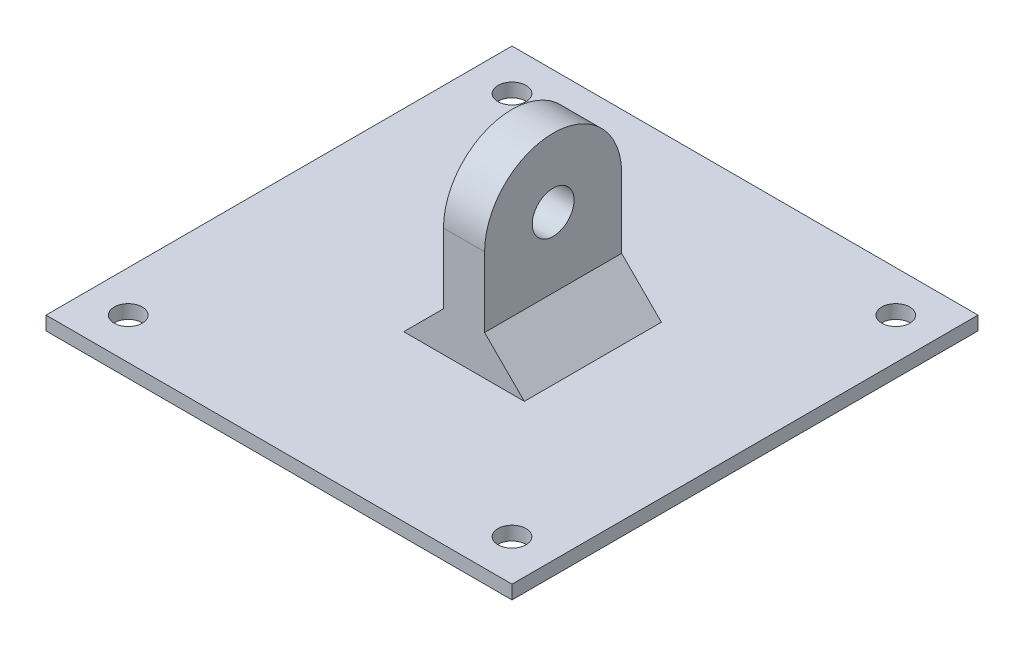
ISO-10303-21;
HEADER;
FILE_DESCRIPTION(('STEP AP214'),'2;1');
FILE_NAME('part.step','',(''),(''),'','','');
FILE_SCHEMA(('AUTOMOTIVE_DESIGN { 1 0 10303 214 1 1 1 1 }'));
ENDSEC;
DATA;
#1=APPLICATION_CONTEXT('core data for automotive mechanical design processes');
#2=APPLICATION_PROTOCOL_DEFINITION('international standard','automotive_design',2000,#1);
#3=PRODUCT_CONTEXT('',#1,'mechanical');
#4=PRODUCT('Part','Part','',(#3));
#5=PRODUCT_RELATED_PRODUCT_CATEGORY('part','',(#4));
#6=PRODUCT_DEFINITION_FORMATION('','',#4);
#7=PRODUCT_DEFINITION_CONTEXT('part definition',#1,'design');
#8=PRODUCT_DEFINITION('design','',#6,#7);
#9=PRODUCT_DEFINITION_SHAPE('','',#8);
#10=(LENGTH_UNIT() NAMED_UNIT(*) SI_UNIT(.MILLI.,.METRE.));
#11=(NAMED_UNIT(*) PLANE_ANGLE_UNIT() SI_UNIT($,.RADIAN.));
#12=(NAMED_UNIT(*) SI_UNIT($,.STERADIAN.) SOLID_ANGLE_UNIT());
#13=UNCERTAINTY_MEASURE_WITH_UNIT(LENGTH_MEASURE(1.E-05),#10,'distance_accuracy_value','');
#14=(GEOMETRIC_REPRESENTATION_CONTEXT(3) GLOBAL_UNCERTAINTY_ASSIGNED_CONTEXT((#13)) GLOBAL_UNIT_ASSIGNED_CONTEXT((#10,
#11,#12)) REPRESENTATION_CONTEXT('',''));
#15=CARTESIAN_POINT('',(0.,0.,0.));
#16=DIRECTION('',(0.,0.,1.));
#17=DIRECTION('',(1.,0.,0.));
#18=AXIS2_PLACEMENT_3D('',#15,#16,#17);
#19=CARTESIAN_POINT('',(0.,1.,0.));
#20=DIRECTION('',(0.,-1.,0.));
#21=DIRECTION('',(0.,0.,-1.));
#22=AXIS2_PLACEMENT_3D('',#19,#20,#21);
#23=PLANE('',#22);
#24=CARTESIAN_POINT('',(-13.9999999999997,1.,14.));
#25=DIRECTION('',(0.,1.,0.));
#26=DIRECTION('',(0.,0.,1.));
#27=AXIS2_PLACEMENT_3D('',#24,#25,#26);
#28=CIRCLE('',#27,1.025);
#29=CARTESIAN_POINT('',(-13.9999999999997,1.,15.025));
#30=VERTEX_POINT('',#29);
#31=EDGE_CURVE('E155',#30,#30,#28,.T.);
#32=ORIENTED_EDGE('',*,*,#31,.F.);
#33=EDGE_LOOP('',(#32));
#34=FACE_BOUND('',#33,.T.);
#35=CARTESIAN_POINT('',(14.0000000000003,1.,14.));
#36=DIRECTION('',(0.,1.,0.));
#37=DIRECTION('',(0.,0.,1.));
#38=AXIS2_PLACEMENT_3D('',#35,#36,#37);
#39=CIRCLE('',#38,1.025);
#40=CARTESIAN_POINT('',(14.0000000000003,1.,15.025));
#41=VERTEX_POINT('',#40);
#42=EDGE_CURVE('E161',#41,#41,#39,.T.);
#43=ORIENTED_EDGE('',*,*,#42,.F.);
#44=EDGE_LOOP('',(#43));
#45=FACE_BOUND('',#44,.T.);
#46=CARTESIAN_POINT('',(14.,1.,-14.));
#47=DIRECTION('',(0.,1.,0.));
#48=DIRECTION('',(0.,0.,1.));
#49=AXIS2_PLACEMENT_3D('',#46,#47,#48);
#50=CIRCLE('',#49,1.025);
#51=CARTESIAN_POINT('',(14.,1.,-12.975));
#52=VERTEX_POINT('',#51);
#53=EDGE_CURVE('E167',#52,#52,#50,.T.);
#54=ORIENTED_EDGE('',*,*,#53,.F.);
#55=EDGE_LOOP('',(#54));
#56=FACE_BOUND('',#55,.T.);
#57=CARTESIAN_POINT('',(-14.,1.,-14.));
#58=DIRECTION('',(0.,1.,0.));
#59=DIRECTION('',(0.,0.,1.));
#60=AXIS2_PLACEMENT_3D('',#57,#58,#59);
#61=CIRCLE('',#60,1.025);
#62=CARTESIAN_POINT('',(-14.,1.,-12.975));
#63=VERTEX_POINT('',#62);
#64=EDGE_CURVE('E173',#63,#63,#61,.T.);
#65=ORIENTED_EDGE('',*,*,#64,.F.);
#66=EDGE_LOOP('',(#65));
#67=FACE_BOUND('',#66,.T.);
#68=DIRECTION('',(0.,0.,-1.));
#69=VECTOR('',#68,1.);
#70=CARTESIAN_POINT('',(17.,1.,17.));
#71=LINE('',#70,#69);
#72=CARTESIAN_POINT('',(17.,1.,17.));
#73=VERTEX_POINT('',#72);
#74=CARTESIAN_POINT('',(17.,1.,-17.));
#75=VERTEX_POINT('',#74);
#76=EDGE_CURVE('E179',#73,#75,#71,.T.);
#77=ORIENTED_EDGE('',*,*,#76,.T.);
#78=DIRECTION('',(-1.,0.,0.));
#79=VECTOR('',#78,1.);
#80=CARTESIAN_POINT('',(-17.,1.,-17.));
#81=LINE('',#80,#79);
#82=CARTESIAN_POINT('',(-17.,1.,-17.));
#83=VERTEX_POINT('',#82);
#84=EDGE_CURVE('E182',#75,#83,#81,.T.);
#85=ORIENTED_EDGE('',*,*,#84,.T.);
#86=DIRECTION('',(0.,0.,1.));
#87=VECTOR('',#86,1.);
#88=CARTESIAN_POINT('',(-17.,1.,17.));
#89=LINE('',#88,#87);
#90=CARTESIAN_POINT('',(-17.,1.,17.));
#91=VERTEX_POINT('',#90);
#92=EDGE_CURVE('E185',#83,#91,#89,.T.);
#93=ORIENTED_EDGE('',*,*,#92,.T.);
#94=DIRECTION('',(1.,0.,0.));
#95=VECTOR('',#94,1.);
#96=CARTESIAN_POINT('',(-17.,1.,17.));
#97=LINE('',#96,#95);
#98=EDGE_CURVE('E187',#91,#73,#97,.T.);
#99=ORIENTED_EDGE('',*,*,#98,.T.);
#100=EDGE_LOOP('',(#77,#85,#93,#99));
#101=FACE_BOUND('',#100,.T.);
#102=DIRECTION('',(0.,0.,-1.));
#103=VECTOR('',#102,1.);
#104=CARTESIAN_POINT('',(-2.90000000000002,1.,0.));
#105=LINE('',#104,#103);
#106=CARTESIAN_POINT('',(-2.90000000000002,1.,5.));
#107=VERTEX_POINT('',#106);
#108=CARTESIAN_POINT('',(-2.90000000000002,1.,-5.));
#109=VERTEX_POINT('',#108);
#110=EDGE_CURVE('E211',#107,#109,#105,.T.);
#111=ORIENTED_EDGE('',*,*,#110,.T.);
#112=DIRECTION('',(-1.,0.,0.));
#113=VECTOR('',#112,1.);
#114=CARTESIAN_POINT('',(3.,1.,-5.));
#115=LINE('',#114,#113);
#116=CARTESIAN_POINT('',(5.89999999999999,1.,-5.));
#117=VERTEX_POINT('',#116);
#118=EDGE_CURVE('E135',#117,#109,#115,.T.);
#119=ORIENTED_EDGE('',*,*,#118,.F.);
#120=DIRECTION('',(0.,0.,1.));
#121=VECTOR('',#120,1.);
#122=CARTESIAN_POINT('',(5.89999999999999,1.,5.));
#123=LINE('',#122,#121);
#124=CARTESIAN_POINT('',(5.89999999999999,1.,5.));
#125=VERTEX_POINT('',#124);
#126=EDGE_CURVE('E208',#117,#125,#123,.T.);
#127=ORIENTED_EDGE('',*,*,#126,.T.);
#128=DIRECTION('',(-1.,0.,0.));
#129=VECTOR('',#128,1.);
#130=CARTESIAN_POINT('',(3.,1.,5.));
#131=LINE('',#130,#129);
#132=EDGE_CURVE('E152',#125,#107,#131,.T.);
#133=ORIENTED_EDGE('',*,*,#132,.T.);
#134=EDGE_LOOP('',(#111,#119,#127,#133));
#135=FACE_BOUND('',#134,.T.);
#136=ADVANCED_FACE('F40',(#34,#45,#56,#67,#101,#135),#23,.F.);
#137=CARTESIAN_POINT('',(0.,0.,0.));
#138=DIRECTION('',(0.,-1.,0.));
#139=DIRECTION('',(0.,0.,-1.));
#140=AXIS2_PLACEMENT_3D('',#137,#138,#139);
#141=PLANE('',#140);
#142=CARTESIAN_POINT('',(14.0000000000003,0.,14.));
#143=DIRECTION('',(0.,1.,0.));
#144=DIRECTION('',(0.,0.,1.));
#145=AXIS2_PLACEMENT_3D('',#142,#143,#144);
#146=CIRCLE('',#145,1.025);
#147=CARTESIAN_POINT('',(14.0000000000003,0.,15.025));
#148=VERTEX_POINT('',#147);
#149=EDGE_CURVE('E158',#148,#148,#146,.T.);
#150=ORIENTED_EDGE('',*,*,#149,.T.);
#151=EDGE_LOOP('',(#150));
#152=FACE_BOUND('',#151,.T.);
#153=CARTESIAN_POINT('',(-14.,0.,-14.));
#154=DIRECTION('',(0.,1.,0.));
#155=DIRECTION('',(0.,0.,1.));
#156=AXIS2_PLACEMENT_3D('',#153,#154,#155);
#157=CIRCLE('',#156,1.025);
#158=CARTESIAN_POINT('',(-14.,0.,-12.975));
#159=VERTEX_POINT('',#158);
#160=EDGE_CURVE('E170',#159,#159,#157,.T.);
#161=ORIENTED_EDGE('',*,*,#160,.T.);
#162=EDGE_LOOP('',(#161));
#163=FACE_BOUND('',#162,.T.);
#164=DIRECTION('',(0.,0.,-1.));
#165=VECTOR('',#164,1.);
#166=CARTESIAN_POINT('',(17.,0.,17.));
#167=LINE('',#166,#165);
#168=CARTESIAN_POINT('',(17.,0.,17.));
#169=VERTEX_POINT('',#168);
#170=CARTESIAN_POINT('',(17.,0.,-17.));
#171=VERTEX_POINT('',#170);
#172=EDGE_CURVE('E176',#169,#171,#167,.T.);
#173=ORIENTED_EDGE('',*,*,#172,.F.);
#174=DIRECTION('',(1.,0.,0.));
#175=VECTOR('',#174,1.);
#176=CARTESIAN_POINT('',(-17.,0.,17.));
#177=LINE('',#176,#175);
#178=CARTESIAN_POINT('',(-17.,0.,17.));
#179=VERTEX_POINT('',#178);
#180=EDGE_CURVE('E183',#179,#169,#177,.T.);
#181=ORIENTED_EDGE('',*,*,#180,.F.);
#182=DIRECTION('',(0.,0.,1.));
#183=VECTOR('',#182,1.);
#184=CARTESIAN_POINT('',(-17.,0.,17.));
#185=LINE('',#184,#183);
#186=CARTESIAN_POINT('',(-17.,0.,-17.));
#187=VERTEX_POINT('',#186);
#188=EDGE_CURVE('E194',#187,#179,#185,.T.);
#189=ORIENTED_EDGE('',*,*,#188,.F.);
#190=DIRECTION('',(-1.,0.,0.));
#191=VECTOR('',#190,1.);
#192=CARTESIAN_POINT('',(-17.,0.,-17.));
#193=LINE('',#192,#191);
#194=EDGE_CURVE('E192',#171,#187,#193,.T.);
#195=ORIENTED_EDGE('',*,*,#194,.F.);
#196=EDGE_LOOP('',(#173,#181,#189,#195));
#197=FACE_BOUND('',#196,.T.);
#198=CARTESIAN_POINT('',(14.,0.,-14.));
#199=DIRECTION('',(0.,1.,0.));
#200=DIRECTION('',(0.,0.,1.));
#201=AXIS2_PLACEMENT_3D('',#198,#199,#200);
#202=CIRCLE('',#201,1.025);
#203=CARTESIAN_POINT('',(14.,0.,-12.975));
#204=VERTEX_POINT('',#203);
#205=EDGE_CURVE('E164',#204,#204,#202,.T.);
#206=ORIENTED_EDGE('',*,*,#205,.T.);
#207=EDGE_LOOP('',(#206));
#208=FACE_BOUND('',#207,.T.);
#209=CARTESIAN_POINT('',(-13.9999999999997,0.,14.));
#210=DIRECTION('',(0.,1.,0.));
#211=DIRECTION('',(0.,0.,1.));
#212=AXIS2_PLACEMENT_3D('',#209,#210,#211);
#213=CIRCLE('',#212,1.025);
#214=CARTESIAN_POINT('',(-13.9999999999997,0.,15.025));
#215=VERTEX_POINT('',#214);
#216=EDGE_CURVE('E154',#215,#215,#213,.T.);
#217=ORIENTED_EDGE('',*,*,#216,.T.);
#218=EDGE_LOOP('',(#217));
#219=FACE_BOUND('',#218,.T.);
#220=ADVANCED_FACE('F255',(#152,#163,#197,#208,#219),#141,.T.);
#221=CARTESIAN_POINT('',(17.,1.,17.));
#222=DIRECTION('',(-1.,0.,0.));
#223=DIRECTION('',(0.,0.,1.));
#224=AXIS2_PLACEMENT_3D('',#221,#222,#223);
#225=PLANE('',#224);
#226=ORIENTED_EDGE('',*,*,#172,.T.);
#227=DIRECTION('',(0.,-1.,0.));
#228=VECTOR('',#227,1.);
#229=CARTESIAN_POINT('',(17.,1.,-17.));
#230=LINE('',#229,#228);
#231=EDGE_CURVE('E205',#75,#171,#230,.T.);
#232=ORIENTED_EDGE('',*,*,#231,.F.);
#233=ORIENTED_EDGE('',*,*,#76,.F.);
#234=DIRECTION('',(0.,-1.,0.));
#235=VECTOR('',#234,1.);
#236=CARTESIAN_POINT('',(17.,1.,17.));
#237=LINE('',#236,#235);
#238=EDGE_CURVE('E189',#73,#169,#237,.T.);
#239=ORIENTED_EDGE('',*,*,#238,.T.);
#240=EDGE_LOOP('',(#226,#232,#233,#239));
#241=FACE_BOUND('',#240,.T.);
#242=ADVANCED_FACE('F261',(#241),#225,.F.);
#243=CARTESIAN_POINT('',(-17.,1.,-17.));
#244=DIRECTION('',(0.,0.,1.));
#245=DIRECTION('',(1.,0.,0.));
#246=AXIS2_PLACEMENT_3D('',#243,#244,#245);
#247=PLANE('',#246);
#248=ORIENTED_EDGE('',*,*,#194,.T.);
#249=DIRECTION('',(0.,-1.,0.));
#250=VECTOR('',#249,1.);
#251=CARTESIAN_POINT('',(-17.,1.,-17.));
#252=LINE('',#251,#250);
#253=EDGE_CURVE('E202',#83,#187,#252,.T.);
#254=ORIENTED_EDGE('',*,*,#253,.F.);
#255=ORIENTED_EDGE('',*,*,#84,.F.);
#256=ORIENTED_EDGE('',*,*,#231,.T.);
#257=EDGE_LOOP('',(#248,#254,#255,#256));
#258=FACE_BOUND('',#257,.T.);
#259=ADVANCED_FACE('F277',(#258),#247,.F.);
#260=CARTESIAN_POINT('',(-17.,1.,17.));
#261=DIRECTION('',(1.,0.,0.));
#262=DIRECTION('',(0.,0.,-1.));
#263=AXIS2_PLACEMENT_3D('',#260,#261,#262);
#264=PLANE('',#263);
#265=ORIENTED_EDGE('',*,*,#188,.T.);
#266=DIRECTION('',(0.,-1.,0.));
#267=VECTOR('',#266,1.);
#268=CARTESIAN_POINT('',(-17.,1.,17.));
#269=LINE('',#268,#267);
#270=EDGE_CURVE('E199',#91,#179,#269,.T.);
#271=ORIENTED_EDGE('',*,*,#270,.F.);
#272=ORIENTED_EDGE('',*,*,#92,.F.);
#273=ORIENTED_EDGE('',*,*,#253,.T.);
#274=EDGE_LOOP('',(#265,#271,#272,#273));
#275=FACE_BOUND('',#274,.T.);
#276=ADVANCED_FACE('F273',(#275),#264,.F.);
#277=CARTESIAN_POINT('',(-17.,1.,17.));
#278=DIRECTION('',(0.,0.,-1.));
#279=DIRECTION('',(-1.,0.,0.));
#280=AXIS2_PLACEMENT_3D('',#277,#278,#279);
#281=PLANE('',#280);
#282=ORIENTED_EDGE('',*,*,#180,.T.);
#283=ORIENTED_EDGE('',*,*,#238,.F.);
#284=ORIENTED_EDGE('',*,*,#98,.F.);
#285=ORIENTED_EDGE('',*,*,#270,.T.);
#286=EDGE_LOOP('',(#282,#283,#284,#285));
#287=FACE_BOUND('',#286,.T.);
#288=ADVANCED_FACE('F270',(#287),#281,.F.);
#289=CARTESIAN_POINT('',(-14.,1.,-14.));
#290=DIRECTION('',(0.,-1.,0.));
#291=DIRECTION('',(0.,0.,-1.));
#292=AXIS2_PLACEMENT_3D('',#289,#290,#291);
#293=CYLINDRICAL_SURFACE('',#292,1.025);
#294=ORIENTED_EDGE('',*,*,#64,.T.);
#295=EDGE_LOOP('',(#294));
#296=FACE_BOUND('',#295,.T.);
#297=ORIENTED_EDGE('',*,*,#160,.F.);
#298=EDGE_LOOP('',(#297));
#299=FACE_BOUND('',#298,.T.);
#300=ADVANCED_FACE('F267',(#296,#299),#293,.F.);
#301=CARTESIAN_POINT('',(14.,1.,-14.));
#302=DIRECTION('',(0.,-1.,0.));
#303=DIRECTION('',(0.,0.,-1.));
#304=AXIS2_PLACEMENT_3D('',#301,#302,#303);
#305=CYLINDRICAL_SURFACE('',#304,1.025);
#306=ORIENTED_EDGE('',*,*,#53,.T.);
#307=EDGE_LOOP('',(#306));
#308=FACE_BOUND('',#307,.T.);
#309=ORIENTED_EDGE('',*,*,#205,.F.);
#310=EDGE_LOOP('',(#309));
#311=FACE_BOUND('',#310,.T.);
#312=ADVANCED_FACE('F304',(#308,#311),#305,.F.);
#313=CARTESIAN_POINT('',(14.0000000000003,1.,14.));
#314=DIRECTION('',(0.,-1.,0.));
#315=DIRECTION('',(0.,0.,-1.));
#316=AXIS2_PLACEMENT_3D('',#313,#314,#315);
#317=CYLINDRICAL_SURFACE('',#316,1.025);
#318=ORIENTED_EDGE('',*,*,#42,.T.);
#319=EDGE_LOOP('',(#318));
#320=FACE_BOUND('',#319,.T.);
#321=ORIENTED_EDGE('',*,*,#149,.F.);
#322=EDGE_LOOP('',(#321));
#323=FACE_BOUND('',#322,.T.);
#324=ADVANCED_FACE('F250',(#320,#323),#317,.F.);
#325=CARTESIAN_POINT('',(-13.9999999999997,1.,14.));
#326=DIRECTION('',(0.,-1.,0.));
#327=DIRECTION('',(0.,0.,-1.));
#328=AXIS2_PLACEMENT_3D('',#325,#326,#327);
#329=CYLINDRICAL_SURFACE('',#328,1.025);
#330=ORIENTED_EDGE('',*,*,#31,.T.);
#331=EDGE_LOOP('',(#330));
#332=FACE_BOUND('',#331,.T.);
#333=ORIENTED_EDGE('',*,*,#216,.F.);
#334=EDGE_LOOP('',(#333));
#335=FACE_BOUND('',#334,.T.);
#336=ADVANCED_FACE('F243',(#332,#335),#329,.F.);
#337=CARTESIAN_POINT('',(3.,9.,0.));
#338=DIRECTION('',(-1.,0.,0.));
#339=DIRECTION('',(0.,0.,1.));
#340=AXIS2_PLACEMENT_3D('',#337,#338,#339);
#341=PLANE('',#340);
#342=DIRECTION('',(0.,-1.,0.));
#343=VECTOR('',#342,1.);
#344=CARTESIAN_POINT('',(3.,1.,5.));
#345=LINE('',#344,#343);
#346=CARTESIAN_POINT('',(3.,9.,5.));
#347=VERTEX_POINT('',#346);
#348=CARTESIAN_POINT('',(3.,3.90000000000001,5.));
#349=VERTEX_POINT('',#348);
#350=EDGE_CURVE('E126',#347,#349,#345,.T.);
#351=ORIENTED_EDGE('',*,*,#350,.T.);
#352=DIRECTION('',(0.,0.,-1.));
#353=VECTOR('',#352,1.);
#354=CARTESIAN_POINT('',(3.,3.90000000000001,-5.));
#355=LINE('',#354,#353);
#356=CARTESIAN_POINT('',(3.,3.90000000000001,-5.));
#357=VERTEX_POINT('',#356);
#358=EDGE_CURVE('E124',#349,#357,#355,.T.);
#359=ORIENTED_EDGE('',*,*,#358,.T.);
#360=DIRECTION('',(0.,1.,0.));
#361=VECTOR('',#360,1.);
#362=CARTESIAN_POINT('',(3.,1.,-5.));
#363=LINE('',#362,#361);
#364=CARTESIAN_POINT('',(3.,9.,-5.));
#365=VERTEX_POINT('',#364);
#366=EDGE_CURVE('E117',#357,#365,#363,.T.);
#367=ORIENTED_EDGE('',*,*,#366,.T.);
#368=CARTESIAN_POINT('',(3.,9.,0.));
#369=DIRECTION('',(1.,0.,0.));
#370=DIRECTION('',(0.,0.,1.));
#371=AXIS2_PLACEMENT_3D('',#368,#369,#370);
#372=CIRCLE('',#371,5.);
#373=EDGE_CURVE('E122',#365,#347,#372,.T.);
#374=ORIENTED_EDGE('',*,*,#373,.T.);
#375=EDGE_LOOP('',(#351,#359,#367,#374));
#376=FACE_BOUND('',#375,.T.);
#377=CARTESIAN_POINT('',(3.,9.,0.));
#378=DIRECTION('',(1.,0.,0.));
#379=DIRECTION('',(0.,0.,-1.));
#380=AXIS2_PLACEMENT_3D('',#377,#378,#379);
#381=CIRCLE('',#380,1.525);
#382=CARTESIAN_POINT('',(3.,9.,-1.525));
#383=VERTEX_POINT('',#382);
#384=EDGE_CURVE('E147',#383,#383,#381,.T.);
#385=ORIENTED_EDGE('',*,*,#384,.F.);
#386=EDGE_LOOP('',(#385));
#387=FACE_BOUND('',#386,.T.);
#388=ADVANCED_FACE('F119',(#376,#387),#341,.F.);
#389=CARTESIAN_POINT('',(0.,9.,0.));
#390=DIRECTION('',(-1.,0.,0.));
#391=DIRECTION('',(0.,0.,1.));
#392=AXIS2_PLACEMENT_3D('',#389,#390,#391);
#393=PLANE('',#392);
#394=DIRECTION('',(0.,1.,0.));
#395=VECTOR('',#394,1.);
#396=CARTESIAN_POINT('',(0.,1.,-5.));
#397=LINE('',#396,#395);
#398=CARTESIAN_POINT('',(0.,3.89999999999999,-5.));
#399=VERTEX_POINT('',#398);
#400=CARTESIAN_POINT('',(0.,9.,-5.));
#401=VERTEX_POINT('',#400);
#402=EDGE_CURVE('E132',#399,#401,#397,.T.);
#403=ORIENTED_EDGE('',*,*,#402,.F.);
#404=DIRECTION('',(0.,0.,1.));
#405=VECTOR('',#404,1.);
#406=CARTESIAN_POINT('',(0.,3.89999999999999,0.));
#407=LINE('',#406,#405);
#408=CARTESIAN_POINT('',(0.,3.89999999999999,5.));
#409=VERTEX_POINT('',#408);
#410=EDGE_CURVE('E214',#399,#409,#407,.T.);
#411=ORIENTED_EDGE('',*,*,#410,.T.);
#412=DIRECTION('',(0.,-1.,0.));
#413=VECTOR('',#412,1.);
#414=CARTESIAN_POINT('',(0.,1.,5.));
#415=LINE('',#414,#413);
#416=CARTESIAN_POINT('',(0.,9.,5.));
#417=VERTEX_POINT('',#416);
#418=EDGE_CURVE('E144',#417,#409,#415,.T.);
#419=ORIENTED_EDGE('',*,*,#418,.F.);
#420=CARTESIAN_POINT('',(0.,9.,0.));
#421=DIRECTION('',(1.,0.,0.));
#422=DIRECTION('',(0.,0.,1.));
#423=AXIS2_PLACEMENT_3D('',#420,#421,#422);
#424=CIRCLE('',#423,5.);
#425=EDGE_CURVE('E149',#401,#417,#424,.T.);
#426=ORIENTED_EDGE('',*,*,#425,.F.);
#427=EDGE_LOOP('',(#403,#411,#419,#426));
#428=FACE_BOUND('',#427,.T.);
#429=CARTESIAN_POINT('',(0.,9.,0.));
#430=DIRECTION('',(1.,0.,0.));
#431=DIRECTION('',(0.,0.,-1.));
#432=AXIS2_PLACEMENT_3D('',#429,#430,#431);
#433=CIRCLE('',#432,1.525);
#434=CARTESIAN_POINT('',(0.,9.,-1.525));
#435=VERTEX_POINT('',#434);
#436=EDGE_CURVE('E234',#435,#435,#433,.T.);
#437=ORIENTED_EDGE('',*,*,#436,.T.);
#438=EDGE_LOOP('',(#437));
#439=FACE_BOUND('',#438,.T.);
#440=ADVANCED_FACE('F229',(#428,#439),#393,.T.);
#441=CARTESIAN_POINT('',(3.,1.,5.));
#442=DIRECTION('',(0.,0.,-1.));
#443=DIRECTION('',(0.,1.,0.));
#444=AXIS2_PLACEMENT_3D('',#441,#442,#443);
#445=PLANE('',#444);
#446=ORIENTED_EDGE('',*,*,#418,.T.);
#447=DIRECTION('',(-0.707106781186551,-0.707106781186544,0.));
#448=VECTOR('',#447,1.);
#449=CARTESIAN_POINT('',(0.0500000000000183,3.95000000000001,5.));
#450=LINE('',#449,#448);
#451=EDGE_CURVE('E219',#409,#107,#450,.T.);
#452=ORIENTED_EDGE('',*,*,#451,.T.);
#453=ORIENTED_EDGE('',*,*,#132,.F.);
#454=DIRECTION('',(0.707106781186544,-0.707106781186551,0.));
#455=VECTOR('',#454,1.);
#456=CARTESIAN_POINT('',(4.45000000000001,2.44999999999999,5.));
#457=LINE('',#456,#455);
#458=EDGE_CURVE('E11',#125,#349,#457,.F.);
#459=ORIENTED_EDGE('',*,*,#458,.T.);
#460=ORIENTED_EDGE('',*,*,#350,.F.);
#461=DIRECTION('',(-1.,0.,0.));
#462=VECTOR('',#461,1.);
#463=CARTESIAN_POINT('',(3.,9.,5.));
#464=LINE('',#463,#462);
#465=EDGE_CURVE('E136',#347,#417,#464,.T.);
#466=ORIENTED_EDGE('',*,*,#465,.T.);
#467=EDGE_LOOP('',(#446,#452,#453,#459,#460,#466));
#468=FACE_BOUND('',#467,.T.);
#469=ADVANCED_FACE('F232',(#468),#445,.F.);
#470=CARTESIAN_POINT('',(3.,1.,-5.));
#471=DIRECTION('',(0.,0.,1.));
#472=DIRECTION('',(0.,-1.,0.));
#473=AXIS2_PLACEMENT_3D('',#470,#471,#472);
#474=PLANE('',#473);
#475=ORIENTED_EDGE('',*,*,#118,.T.);
#476=DIRECTION('',(0.707106781186551,0.707106781186544,0.));
#477=VECTOR('',#476,1.);
#478=CARTESIAN_POINT('',(0.0500000000000183,3.95000000000001,-5.));
#479=LINE('',#478,#477);
#480=EDGE_CURVE('E217',#109,#399,#479,.T.);
#481=ORIENTED_EDGE('',*,*,#480,.T.);
#482=ORIENTED_EDGE('',*,*,#402,.T.);
#483=DIRECTION('',(-1.,0.,0.));
#484=VECTOR('',#483,1.);
#485=CARTESIAN_POINT('',(3.,9.,-5.));
#486=LINE('',#485,#484);
#487=EDGE_CURVE('E129',#365,#401,#486,.T.);
#488=ORIENTED_EDGE('',*,*,#487,.F.);
#489=ORIENTED_EDGE('',*,*,#366,.F.);
#490=DIRECTION('',(-0.707106781186544,0.707106781186551,0.));
#491=VECTOR('',#490,1.);
#492=CARTESIAN_POINT('',(4.45000000000001,2.44999999999999,-5.));
#493=LINE('',#492,#491);
#494=EDGE_CURVE('E49',#357,#117,#493,.F.);
#495=ORIENTED_EDGE('',*,*,#494,.T.);
#496=EDGE_LOOP('',(#475,#481,#482,#488,#489,#495));
#497=FACE_BOUND('',#496,.T.);
#498=ADVANCED_FACE('F130',(#497),#474,.F.);
#499=CARTESIAN_POINT('',(3.,9.,0.));
#500=DIRECTION('',(-1.,0.,0.));
#501=DIRECTION('',(0.,0.,1.));
#502=AXIS2_PLACEMENT_3D('',#499,#500,#501);
#503=CYLINDRICAL_SURFACE('',#502,5.);
#504=ORIENTED_EDGE('',*,*,#425,.T.);
#505=ORIENTED_EDGE('',*,*,#465,.F.);
#506=ORIENTED_EDGE('',*,*,#373,.F.);
#507=ORIENTED_EDGE('',*,*,#487,.T.);
#508=EDGE_LOOP('',(#504,#505,#506,#507));
#509=FACE_BOUND('',#508,.T.);
#510=ADVANCED_FACE('F138',(#509),#503,.T.);
#511=CARTESIAN_POINT('',(3.,9.,0.));
#512=DIRECTION('',(-1.,0.,0.));
#513=DIRECTION('',(0.,0.,1.));
#514=AXIS2_PLACEMENT_3D('',#511,#512,#513);
#515=CYLINDRICAL_SURFACE('',#514,1.525);
#516=ORIENTED_EDGE('',*,*,#384,.T.);
#517=EDGE_LOOP('',(#516));
#518=FACE_BOUND('',#517,.T.);
#519=ORIENTED_EDGE('',*,*,#436,.F.);
#520=EDGE_LOOP('',(#519));
#521=FACE_BOUND('',#520,.T.);
#522=ADVANCED_FACE('F240',(#518,#521),#515,.F.);
#523=CARTESIAN_POINT('',(-2.90000000000002,1.,0.));
#524=DIRECTION('',(0.707106781186544,-0.707106781186551,0.));
#525=DIRECTION('',(0.,0.,-1.));
#526=AXIS2_PLACEMENT_3D('',#523,#524,#525);
#527=PLANE('',#526);
#528=ORIENTED_EDGE('',*,*,#451,.F.);
#529=ORIENTED_EDGE('',*,*,#410,.F.);
#530=ORIENTED_EDGE('',*,*,#480,.F.);
#531=ORIENTED_EDGE('',*,*,#110,.F.);
#532=EDGE_LOOP('',(#528,#529,#530,#531));
#533=FACE_BOUND('',#532,.T.);
#534=ADVANCED_FACE('F226',(#533),#527,.F.);
#535=CARTESIAN_POINT('',(3.,3.90000000000001,0.));
#536=DIRECTION('',(0.707106781186551,0.707106781186544,0.));
#537=DIRECTION('',(0.,0.,1.));
#538=AXIS2_PLACEMENT_3D('',#535,#536,#537);
#539=PLANE('',#538);
#540=ORIENTED_EDGE('',*,*,#458,.F.);
#541=ORIENTED_EDGE('',*,*,#126,.F.);
#542=ORIENTED_EDGE('',*,*,#494,.F.);
#543=ORIENTED_EDGE('',*,*,#358,.F.);
#544=EDGE_LOOP('',(#540,#541,#542,#543));
#545=FACE_BOUND('',#544,.T.);
#546=ADVANCED_FACE('F43',(#545),#539,.T.);
#547=CLOSED_SHELL('',(#136,#220,#242,#259,#276,#288,#300,#312,#324,#336,#388,#440,#469,#498,
#510,#522,#534,#546));
#548=MANIFOLD_SOLID_BREP('B2',#547);
#549=ADVANCED_BREP_SHAPE_REPRESENTATION('',(#18,#548),#14);
#550=SHAPE_DEFINITION_REPRESENTATION(#9,#549);
ENDSEC;
END-ISO-10303-21;
